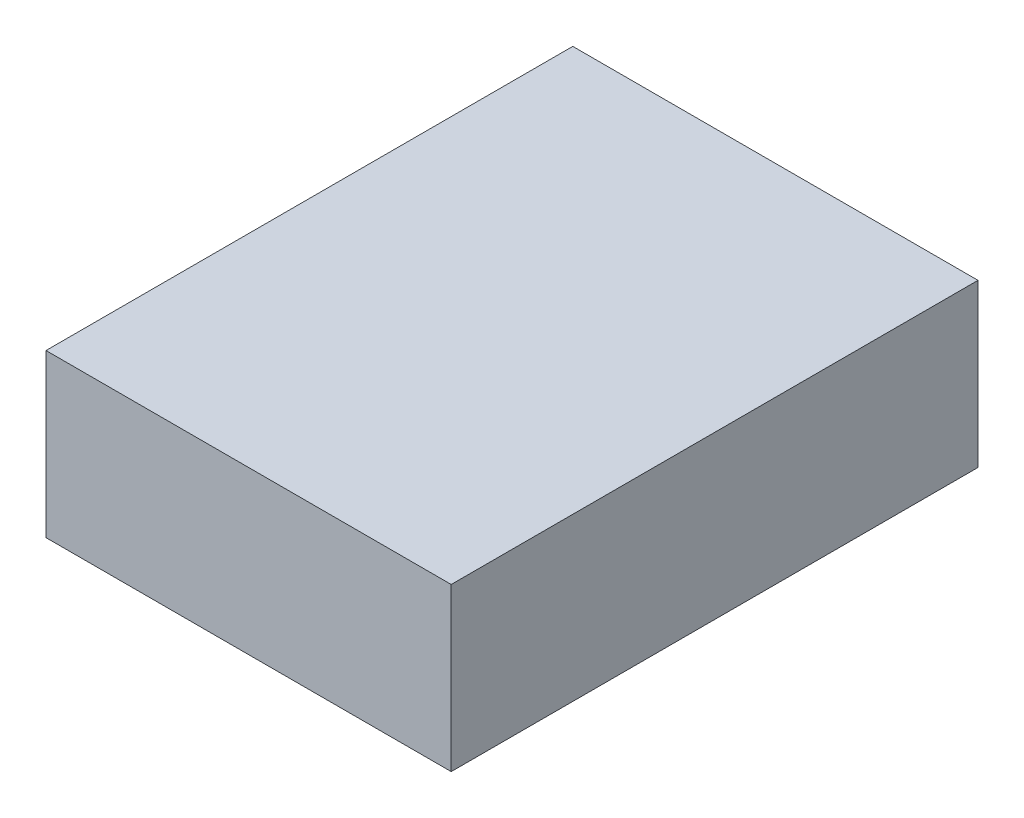
ISO-10303-21;
HEADER;
FILE_DESCRIPTION(('STEP AP214'),'2;1');
FILE_NAME('part.step','',(''),(''),'','','');
FILE_SCHEMA(('AUTOMOTIVE_DESIGN { 1 0 10303 214 1 1 1 1 }'));
ENDSEC;
DATA;
#1=APPLICATION_CONTEXT('core data for automotive mechanical design processes');
#2=APPLICATION_PROTOCOL_DEFINITION('international standard','automotive_design',2000,#1);
#3=PRODUCT_CONTEXT('',#1,'mechanical');
#4=PRODUCT('Part','Part','',(#3));
#5=PRODUCT_RELATED_PRODUCT_CATEGORY('part','',(#4));
#6=PRODUCT_DEFINITION_FORMATION('','',#4);
#7=PRODUCT_DEFINITION_CONTEXT('part definition',#1,'design');
#8=PRODUCT_DEFINITION('design','',#6,#7);
#9=PRODUCT_DEFINITION_SHAPE('','',#8);
#10=(LENGTH_UNIT() NAMED_UNIT(*) SI_UNIT(.MILLI.,.METRE.));
#11=(NAMED_UNIT(*) PLANE_ANGLE_UNIT() SI_UNIT($,.RADIAN.));
#12=(NAMED_UNIT(*) SI_UNIT($,.STERADIAN.) SOLID_ANGLE_UNIT());
#13=UNCERTAINTY_MEASURE_WITH_UNIT(LENGTH_MEASURE(1.E-05),#10,'distance_accuracy_value','');
#14=(GEOMETRIC_REPRESENTATION_CONTEXT(3) GLOBAL_UNCERTAINTY_ASSIGNED_CONTEXT((#13)) GLOBAL_UNIT_ASSIGNED_CONTEXT((#10,
#11,#12)) REPRESENTATION_CONTEXT('',''));
#15=CARTESIAN_POINT('',(0.,0.,0.));
#16=DIRECTION('',(0.,0.,1.));
#17=DIRECTION('',(1.,0.,0.));
#18=AXIS2_PLACEMENT_3D('',#15,#16,#17);
#19=CARTESIAN_POINT('',(5.,4.,6.5));
#20=DIRECTION('',(-1.,0.,0.));
#21=DIRECTION('',(0.,0.,1.));
#22=AXIS2_PLACEMENT_3D('',#19,#20,#21);
#23=PLANE('',#22);
#24=DIRECTION('',(0.,0.,-1.));
#25=VECTOR('',#24,1.);
#26=CARTESIAN_POINT('',(5.,0.,6.5));
#27=LINE('',#26,#25);
#28=CARTESIAN_POINT('',(5.,0.,6.5));
#29=VERTEX_POINT('',#28);
#30=CARTESIAN_POINT('',(5.,0.,-6.5));
#31=VERTEX_POINT('',#30);
#32=EDGE_CURVE('E97',#29,#31,#27,.T.);
#33=ORIENTED_EDGE('',*,*,#32,.T.);
#34=DIRECTION('',(0.,-1.,0.));
#35=VECTOR('',#34,1.);
#36=CARTESIAN_POINT('',(5.,4.,-6.5));
#37=LINE('',#36,#35);
#38=CARTESIAN_POINT('',(5.,4.,-6.5));
#39=VERTEX_POINT('',#38);
#40=EDGE_CURVE('E11',#39,#31,#37,.T.);
#41=ORIENTED_EDGE('',*,*,#40,.F.);
#42=DIRECTION('',(0.,0.,-1.));
#43=VECTOR('',#42,1.);
#44=CARTESIAN_POINT('',(5.,4.,6.5));
#45=LINE('',#44,#43);
#46=CARTESIAN_POINT('',(5.,4.,6.5));
#47=VERTEX_POINT('',#46);
#48=EDGE_CURVE('E85',#47,#39,#45,.T.);
#49=ORIENTED_EDGE('',*,*,#48,.F.);
#50=DIRECTION('',(0.,-1.,0.));
#51=VECTOR('',#50,1.);
#52=CARTESIAN_POINT('',(5.,4.,6.5));
#53=LINE('',#52,#51);
#54=EDGE_CURVE('E93',#47,#29,#53,.T.);
#55=ORIENTED_EDGE('',*,*,#54,.T.);
#56=EDGE_LOOP('',(#33,#41,#49,#55));
#57=FACE_BOUND('',#56,.T.);
#58=ADVANCED_FACE('F34',(#57),#23,.F.);
#59=CARTESIAN_POINT('',(-5.,4.,-6.5));
#60=DIRECTION('',(0.,0.,1.));
#61=DIRECTION('',(1.,0.,0.));
#62=AXIS2_PLACEMENT_3D('',#59,#60,#61);
#63=PLANE('',#62);
#64=DIRECTION('',(-1.,0.,0.));
#65=VECTOR('',#64,1.);
#66=CARTESIAN_POINT('',(-5.,0.,-6.5));
#67=LINE('',#66,#65);
#68=CARTESIAN_POINT('',(-5.,0.,-6.5));
#69=VERTEX_POINT('',#68);
#70=EDGE_CURVE('E89',#31,#69,#67,.T.);
#71=ORIENTED_EDGE('',*,*,#70,.T.);
#72=DIRECTION('',(0.,-1.,0.));
#73=VECTOR('',#72,1.);
#74=CARTESIAN_POINT('',(-5.,4.,-6.5));
#75=LINE('',#74,#73);
#76=CARTESIAN_POINT('',(-5.,4.,-6.5));
#77=VERTEX_POINT('',#76);
#78=EDGE_CURVE('E42',#77,#69,#75,.T.);
#79=ORIENTED_EDGE('',*,*,#78,.F.);
#80=DIRECTION('',(-1.,0.,0.));
#81=VECTOR('',#80,1.);
#82=CARTESIAN_POINT('',(-5.,4.,-6.5));
#83=LINE('',#82,#81);
#84=EDGE_CURVE('E80',#39,#77,#83,.T.);
#85=ORIENTED_EDGE('',*,*,#84,.F.);
#86=ORIENTED_EDGE('',*,*,#40,.T.);
#87=EDGE_LOOP('',(#71,#79,#85,#86));
#88=FACE_BOUND('',#87,.T.);
#89=ADVANCED_FACE('F88',(#88),#63,.F.);
#90=CARTESIAN_POINT('',(-5.,4.,6.5));
#91=DIRECTION('',(1.,0.,0.));
#92=DIRECTION('',(0.,0.,-1.));
#93=AXIS2_PLACEMENT_3D('',#90,#91,#92);
#94=PLANE('',#93);
#95=DIRECTION('',(0.,0.,1.));
#96=VECTOR('',#95,1.);
#97=CARTESIAN_POINT('',(-5.,0.,6.5));
#98=LINE('',#97,#96);
#99=CARTESIAN_POINT('',(-5.,0.,6.5));
#100=VERTEX_POINT('',#99);
#101=EDGE_CURVE('E67',#69,#100,#98,.T.);
#102=ORIENTED_EDGE('',*,*,#101,.T.);
#103=DIRECTION('',(0.,-1.,0.));
#104=VECTOR('',#103,1.);
#105=CARTESIAN_POINT('',(-5.,4.,6.5));
#106=LINE('',#105,#104);
#107=CARTESIAN_POINT('',(-5.,4.,6.5));
#108=VERTEX_POINT('',#107);
#109=EDGE_CURVE('E90',#108,#100,#106,.T.);
#110=ORIENTED_EDGE('',*,*,#109,.F.);
#111=DIRECTION('',(0.,0.,1.));
#112=VECTOR('',#111,1.);
#113=CARTESIAN_POINT('',(-5.,4.,6.5));
#114=LINE('',#113,#112);
#115=EDGE_CURVE('E83',#77,#108,#114,.T.);
#116=ORIENTED_EDGE('',*,*,#115,.F.);
#117=ORIENTED_EDGE('',*,*,#78,.T.);
#118=EDGE_LOOP('',(#102,#110,#116,#117));
#119=FACE_BOUND('',#118,.T.);
#120=ADVANCED_FACE('F91',(#119),#94,.F.);
#121=CARTESIAN_POINT('',(-5.,4.,6.5));
#122=DIRECTION('',(0.,0.,-1.));
#123=DIRECTION('',(-1.,0.,0.));
#124=AXIS2_PLACEMENT_3D('',#121,#122,#123);
#125=PLANE('',#124);
#126=DIRECTION('',(1.,0.,0.));
#127=VECTOR('',#126,1.);
#128=CARTESIAN_POINT('',(-5.,0.,6.5));
#129=LINE('',#128,#127);
#130=EDGE_CURVE('E73',#100,#29,#129,.T.);
#131=ORIENTED_EDGE('',*,*,#130,.T.);
#132=ORIENTED_EDGE('',*,*,#54,.F.);
#133=DIRECTION('',(1.,0.,0.));
#134=VECTOR('',#133,1.);
#135=CARTESIAN_POINT('',(-5.,4.,6.5));
#136=LINE('',#135,#134);
#137=EDGE_CURVE('E50',#108,#47,#136,.T.);
#138=ORIENTED_EDGE('',*,*,#137,.F.);
#139=ORIENTED_EDGE('',*,*,#109,.T.);
#140=EDGE_LOOP('',(#131,#132,#138,#139));
#141=FACE_BOUND('',#140,.T.);
#142=ADVANCED_FACE('F104',(#141),#125,.F.);
#143=CARTESIAN_POINT('',(0.,4.,0.));
#144=DIRECTION('',(0.,-1.,0.));
#145=DIRECTION('',(0.,0.,-1.));
#146=AXIS2_PLACEMENT_3D('',#143,#144,#145);
#147=PLANE('',#146);
#148=ORIENTED_EDGE('',*,*,#48,.T.);
#149=ORIENTED_EDGE('',*,*,#84,.T.);
#150=ORIENTED_EDGE('',*,*,#115,.T.);
#151=ORIENTED_EDGE('',*,*,#137,.T.);
#152=EDGE_LOOP('',(#148,#149,#150,#151));
#153=FACE_BOUND('',#152,.T.);
#154=ADVANCED_FACE('F81',(#153),#147,.F.);
#155=CARTESIAN_POINT('',(0.,0.,0.));
#156=DIRECTION('',(0.,-1.,0.));
#157=DIRECTION('',(0.,0.,-1.));
#158=AXIS2_PLACEMENT_3D('',#155,#156,#157);
#159=PLANE('',#158);
#160=ORIENTED_EDGE('',*,*,#32,.F.);
#161=ORIENTED_EDGE('',*,*,#130,.F.);
#162=ORIENTED_EDGE('',*,*,#101,.F.);
#163=ORIENTED_EDGE('',*,*,#70,.F.);
#164=EDGE_LOOP('',(#160,#161,#162,#163));
#165=FACE_BOUND('',#164,.T.);
#166=ADVANCED_FACE('F107',(#165),#159,.T.);
#167=CLOSED_SHELL('',(#58,#89,#120,#142,#154,#166));
#168=MANIFOLD_SOLID_BREP('B2',#167);
#169=ADVANCED_BREP_SHAPE_REPRESENTATION('',(#18,#168),#14);
#170=SHAPE_DEFINITION_REPRESENTATION(#9,#169);
ENDSEC;
END-ISO-10303-21;
